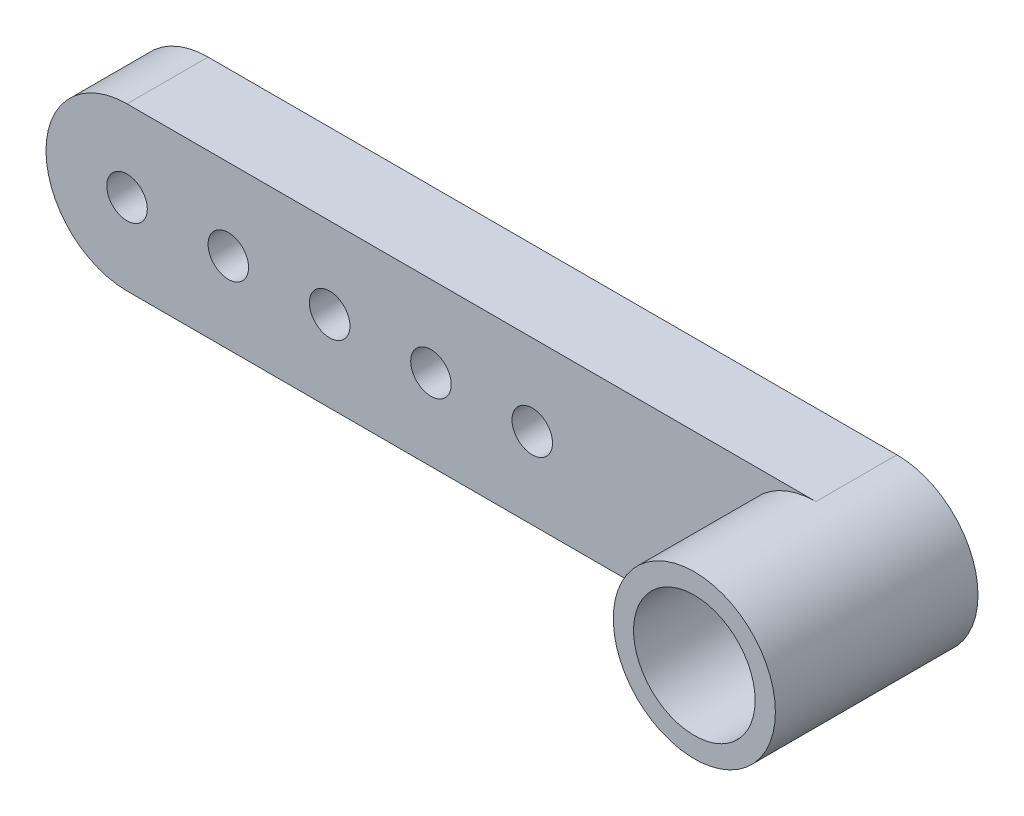
ISO-10303-21;
HEADER;
FILE_DESCRIPTION(('STEP AP214'),'2;1');
FILE_NAME('part.step','',(''),(''),'','','');
FILE_SCHEMA(('AUTOMOTIVE_DESIGN { 1 0 10303 214 1 1 1 1 }'));
ENDSEC;
DATA;
#1=APPLICATION_CONTEXT('core data for automotive mechanical design processes');
#2=APPLICATION_PROTOCOL_DEFINITION('international standard','automotive_design',2000,#1);
#3=PRODUCT_CONTEXT('',#1,'mechanical');
#4=PRODUCT('Part','Part','',(#3));
#5=PRODUCT_RELATED_PRODUCT_CATEGORY('part','',(#4));
#6=PRODUCT_DEFINITION_FORMATION('','',#4);
#7=PRODUCT_DEFINITION_CONTEXT('part definition',#1,'design');
#8=PRODUCT_DEFINITION('design','',#6,#7);
#9=PRODUCT_DEFINITION_SHAPE('','',#8);
#10=(LENGTH_UNIT() NAMED_UNIT(*) SI_UNIT(.MILLI.,.METRE.));
#11=(NAMED_UNIT(*) PLANE_ANGLE_UNIT() SI_UNIT($,.RADIAN.));
#12=(NAMED_UNIT(*) SI_UNIT($,.STERADIAN.) SOLID_ANGLE_UNIT());
#13=UNCERTAINTY_MEASURE_WITH_UNIT(LENGTH_MEASURE(1.E-05),#10,'distance_accuracy_value','');
#14=(GEOMETRIC_REPRESENTATION_CONTEXT(3) GLOBAL_UNCERTAINTY_ASSIGNED_CONTEXT((#13)) GLOBAL_UNIT_ASSIGNED_CONTEXT((#10,
#11,#12)) REPRESENTATION_CONTEXT('',''));
#15=CARTESIAN_POINT('',(0.,0.,0.));
#16=DIRECTION('',(0.,0.,1.));
#17=DIRECTION('',(1.,0.,0.));
#18=AXIS2_PLACEMENT_3D('',#15,#16,#17);
#19=CARTESIAN_POINT('',(-8.5,0.,2.));
#20=DIRECTION('',(0.,0.,-1.));
#21=DIRECTION('',(-1.,0.,0.));
#22=AXIS2_PLACEMENT_3D('',#19,#20,#21);
#23=CYLINDRICAL_SURFACE('',#22,2.);
#24=CARTESIAN_POINT('',(-8.5,0.,0.));
#25=DIRECTION('',(0.,0.,1.));
#26=DIRECTION('',(1.,0.,0.));
#27=AXIS2_PLACEMENT_3D('',#24,#25,#26);
#28=CIRCLE('',#27,2.);
#29=CARTESIAN_POINT('',(-8.5,2.,0.));
#30=VERTEX_POINT('',#29);
#31=CARTESIAN_POINT('',(-8.5,-2.,0.));
#32=VERTEX_POINT('',#31);
#33=EDGE_CURVE('E112',#30,#32,#28,.T.);
#34=ORIENTED_EDGE('',*,*,#33,.T.);
#35=DIRECTION('',(0.,0.,-1.));
#36=VECTOR('',#35,1.);
#37=CARTESIAN_POINT('',(-8.5,-2.,2.));
#38=LINE('',#37,#36);
#39=CARTESIAN_POINT('',(-8.5,-2.,2.));
#40=VERTEX_POINT('',#39);
#41=EDGE_CURVE('E11',#40,#32,#38,.T.);
#42=ORIENTED_EDGE('',*,*,#41,.F.);
#43=CARTESIAN_POINT('',(-8.5,0.,2.));
#44=DIRECTION('',(0.,0.,1.));
#45=DIRECTION('',(1.,0.,0.));
#46=AXIS2_PLACEMENT_3D('',#43,#44,#45);
#47=CIRCLE('',#46,2.);
#48=CARTESIAN_POINT('',(-8.5,2.,2.));
#49=VERTEX_POINT('',#48);
#50=EDGE_CURVE('E119',#49,#40,#47,.T.);
#51=ORIENTED_EDGE('',*,*,#50,.F.);
#52=DIRECTION('',(0.,0.,-1.));
#53=VECTOR('',#52,1.);
#54=CARTESIAN_POINT('',(-8.5,2.,2.));
#55=LINE('',#54,#53);
#56=EDGE_CURVE('E94',#49,#30,#55,.T.);
#57=ORIENTED_EDGE('',*,*,#56,.T.);
#58=EDGE_LOOP('',(#34,#42,#51,#57));
#59=FACE_BOUND('',#58,.T.);
#60=ADVANCED_FACE('F43',(#59),#23,.T.);
#61=CARTESIAN_POINT('',(-8.5,-2.,2.));
#62=DIRECTION('',(0.,1.,0.));
#63=DIRECTION('',(0.,0.,1.));
#64=AXIS2_PLACEMENT_3D('',#61,#62,#63);
#65=PLANE('',#64);
#66=DIRECTION('',(1.,0.,0.));
#67=VECTOR('',#66,1.);
#68=CARTESIAN_POINT('',(-8.5,-2.,0.));
#69=LINE('',#68,#67);
#70=CARTESIAN_POINT('',(8.5,-2.,0.));
#71=VERTEX_POINT('',#70);
#72=EDGE_CURVE('E127',#32,#71,#69,.T.);
#73=ORIENTED_EDGE('',*,*,#72,.T.);
#74=DIRECTION('',(0.,0.,-1.));
#75=VECTOR('',#74,1.);
#76=CARTESIAN_POINT('',(8.5,-2.,2.));
#77=LINE('',#76,#75);
#78=CARTESIAN_POINT('',(8.5,-2.,2.));
#79=VERTEX_POINT('',#78);
#80=EDGE_CURVE('E53',#79,#71,#77,.T.);
#81=ORIENTED_EDGE('',*,*,#80,.F.);
#82=DIRECTION('',(1.,0.,0.));
#83=VECTOR('',#82,1.);
#84=CARTESIAN_POINT('',(-8.5,-2.,2.));
#85=LINE('',#84,#83);
#86=EDGE_CURVE('E90',#40,#79,#85,.T.);
#87=ORIENTED_EDGE('',*,*,#86,.F.);
#88=ORIENTED_EDGE('',*,*,#41,.T.);
#89=EDGE_LOOP('',(#73,#81,#87,#88));
#90=FACE_BOUND('',#89,.T.);
#91=ADVANCED_FACE('F142',(#90),#65,.F.);
#92=CARTESIAN_POINT('',(8.5,0.,2.));
#93=DIRECTION('',(0.,0.,-1.));
#94=DIRECTION('',(-1.,0.,0.));
#95=AXIS2_PLACEMENT_3D('',#92,#93,#94);
#96=CYLINDRICAL_SURFACE('',#95,2.);
#97=CARTESIAN_POINT('',(8.5,0.,0.));
#98=DIRECTION('',(0.,0.,1.));
#99=DIRECTION('',(1.,0.,0.));
#100=AXIS2_PLACEMENT_3D('',#97,#98,#99);
#101=CIRCLE('',#100,2.);
#102=CARTESIAN_POINT('',(8.5,2.,0.));
#103=VERTEX_POINT('',#102);
#104=EDGE_CURVE('E80',#71,#103,#101,.T.);
#105=ORIENTED_EDGE('',*,*,#104,.T.);
#106=DIRECTION('',(0.,0.,-1.));
#107=VECTOR('',#106,1.);
#108=CARTESIAN_POINT('',(8.5,2.,2.));
#109=LINE('',#108,#107);
#110=CARTESIAN_POINT('',(8.5,2.,2.));
#111=VERTEX_POINT('',#110);
#112=EDGE_CURVE('E93',#111,#103,#109,.T.);
#113=ORIENTED_EDGE('',*,*,#112,.F.);
#114=CARTESIAN_POINT('',(8.5,0.,2.));
#115=DIRECTION('',(0.,0.,1.));
#116=DIRECTION('',(1.,0.,0.));
#117=AXIS2_PLACEMENT_3D('',#114,#115,#116);
#118=CIRCLE('',#117,2.);
#119=EDGE_CURVE('E101',#111,#79,#118,.T.);
#120=ORIENTED_EDGE('',*,*,#119,.T.);
#121=ORIENTED_EDGE('',*,*,#80,.T.);
#122=EDGE_LOOP('',(#105,#113,#120,#121));
#123=FACE_BOUND('',#122,.T.);
#124=CARTESIAN_POINT('',(8.5,0.,5.));
#125=DIRECTION('',(0.,0.,1.));
#126=DIRECTION('',(1.,0.,0.));
#127=AXIS2_PLACEMENT_3D('',#124,#125,#126);
#128=CIRCLE('',#127,2.);
#129=CARTESIAN_POINT('',(10.5,0.,5.));
#130=VERTEX_POINT('',#129);
#131=EDGE_CURVE('E106',#130,#130,#128,.T.);
#132=ORIENTED_EDGE('',*,*,#131,.F.);
#133=EDGE_LOOP('',(#132));
#134=FACE_BOUND('',#133,.T.);
#135=ADVANCED_FACE('F99',(#123,#134),#96,.T.);
#136=CARTESIAN_POINT('',(-8.5,2.,2.));
#137=DIRECTION('',(0.,-1.,0.));
#138=DIRECTION('',(0.,0.,-1.));
#139=AXIS2_PLACEMENT_3D('',#136,#137,#138);
#140=PLANE('',#139);
#141=DIRECTION('',(-1.,0.,0.));
#142=VECTOR('',#141,1.);
#143=CARTESIAN_POINT('',(-8.5,2.,0.));
#144=LINE('',#143,#142);
#145=EDGE_CURVE('E85',#103,#30,#144,.T.);
#146=ORIENTED_EDGE('',*,*,#145,.T.);
#147=ORIENTED_EDGE('',*,*,#56,.F.);
#148=DIRECTION('',(-1.,0.,0.));
#149=VECTOR('',#148,1.);
#150=CARTESIAN_POINT('',(-8.5,2.,2.));
#151=LINE('',#150,#149);
#152=EDGE_CURVE('E61',#111,#49,#151,.T.);
#153=ORIENTED_EDGE('',*,*,#152,.F.);
#154=ORIENTED_EDGE('',*,*,#112,.T.);
#155=EDGE_LOOP('',(#146,#147,#153,#154));
#156=FACE_BOUND('',#155,.T.);
#157=ADVANCED_FACE('F92',(#156),#140,.F.);
#158=CARTESIAN_POINT('',(-8.5,0.,2.));
#159=DIRECTION('',(0.,0.,1.));
#160=DIRECTION('',(1.,0.,0.));
#161=AXIS2_PLACEMENT_3D('',#158,#159,#160);
#162=PLANE('',#161);
#163=CARTESIAN_POINT('',(1.5,0.,2.));
#164=DIRECTION('',(0.,0.,1.));
#165=DIRECTION('',(1.,0.,0.));
#166=AXIS2_PLACEMENT_3D('',#163,#164,#165);
#167=CIRCLE('',#166,0.500000000000001);
#168=CARTESIAN_POINT('',(2.,0.,2.));
#169=VERTEX_POINT('',#168);
#170=EDGE_CURVE('E198',#169,#169,#167,.T.);
#171=ORIENTED_EDGE('',*,*,#170,.F.);
#172=EDGE_LOOP('',(#171));
#173=FACE_BOUND('',#172,.T.);
#174=CARTESIAN_POINT('',(-1.,0.,2.));
#175=DIRECTION('',(0.,0.,1.));
#176=DIRECTION('',(1.,0.,0.));
#177=AXIS2_PLACEMENT_3D('',#174,#175,#176);
#178=CIRCLE('',#177,0.500000000000001);
#179=CARTESIAN_POINT('',(-0.5,0.,2.));
#180=VERTEX_POINT('',#179);
#181=EDGE_CURVE('E233',#180,#180,#178,.T.);
#182=ORIENTED_EDGE('',*,*,#181,.F.);
#183=EDGE_LOOP('',(#182));
#184=FACE_BOUND('',#183,.T.);
#185=CARTESIAN_POINT('',(-3.5,0.,2.));
#186=DIRECTION('',(0.,0.,1.));
#187=DIRECTION('',(1.,0.,0.));
#188=AXIS2_PLACEMENT_3D('',#185,#186,#187);
#189=CIRCLE('',#188,0.500000000000001);
#190=CARTESIAN_POINT('',(-3.,0.,2.));
#191=VERTEX_POINT('',#190);
#192=EDGE_CURVE('E229',#191,#191,#189,.T.);
#193=ORIENTED_EDGE('',*,*,#192,.F.);
#194=EDGE_LOOP('',(#193));
#195=FACE_BOUND('',#194,.T.);
#196=CARTESIAN_POINT('',(-6.,0.,2.));
#197=DIRECTION('',(0.,0.,1.));
#198=DIRECTION('',(1.,0.,0.));
#199=AXIS2_PLACEMENT_3D('',#196,#197,#198);
#200=CIRCLE('',#199,0.500000000000001);
#201=CARTESIAN_POINT('',(-5.5,0.,2.));
#202=VERTEX_POINT('',#201);
#203=EDGE_CURVE('E209',#202,#202,#200,.T.);
#204=ORIENTED_EDGE('',*,*,#203,.F.);
#205=EDGE_LOOP('',(#204));
#206=FACE_BOUND('',#205,.T.);
#207=CARTESIAN_POINT('',(-8.50000000000001,0.,2.));
#208=DIRECTION('',(0.,0.,1.));
#209=DIRECTION('',(1.,0.,0.));
#210=AXIS2_PLACEMENT_3D('',#207,#208,#209);
#211=CIRCLE('',#210,0.500000000000003);
#212=CARTESIAN_POINT('',(-8.00000000000001,0.,2.));
#213=VERTEX_POINT('',#212);
#214=EDGE_CURVE('E203',#213,#213,#211,.T.);
#215=ORIENTED_EDGE('',*,*,#214,.F.);
#216=EDGE_LOOP('',(#215));
#217=FACE_BOUND('',#216,.T.);
#218=ORIENTED_EDGE('',*,*,#119,.F.);
#219=ORIENTED_EDGE('',*,*,#152,.T.);
#220=ORIENTED_EDGE('',*,*,#50,.T.);
#221=ORIENTED_EDGE('',*,*,#86,.T.);
#222=EDGE_LOOP('',(#218,#219,#220,#221));
#223=FACE_BOUND('',#222,.T.);
#224=ADVANCED_FACE('F104',(#173,#184,#195,#206,#217,#223),#162,.T.);
#225=CARTESIAN_POINT('',(-8.5,0.,0.));
#226=DIRECTION('',(0.,0.,1.));
#227=DIRECTION('',(1.,0.,0.));
#228=AXIS2_PLACEMENT_3D('',#225,#226,#227);
#229=PLANE('',#228);
#230=CARTESIAN_POINT('',(1.5,0.,0.));
#231=DIRECTION('',(0.,0.,-1.));
#232=DIRECTION('',(-1.,0.,0.));
#233=AXIS2_PLACEMENT_3D('',#230,#231,#232);
#234=CIRCLE('',#233,0.500000000000001);
#235=CARTESIAN_POINT('',(0.999999999999999,0.,0.));
#236=VERTEX_POINT('',#235);
#237=EDGE_CURVE('E201',#236,#236,#234,.T.);
#238=ORIENTED_EDGE('',*,*,#237,.F.);
#239=EDGE_LOOP('',(#238));
#240=FACE_BOUND('',#239,.T.);
#241=CARTESIAN_POINT('',(-1.,0.,0.));
#242=DIRECTION('',(0.,0.,-1.));
#243=DIRECTION('',(-1.,0.,0.));
#244=AXIS2_PLACEMENT_3D('',#241,#242,#243);
#245=CIRCLE('',#244,0.500000000000001);
#246=CARTESIAN_POINT('',(-1.5,0.,0.));
#247=VERTEX_POINT('',#246);
#248=EDGE_CURVE('E204',#247,#247,#245,.T.);
#249=ORIENTED_EDGE('',*,*,#248,.F.);
#250=EDGE_LOOP('',(#249));
#251=FACE_BOUND('',#250,.T.);
#252=CARTESIAN_POINT('',(-3.5,0.,0.));
#253=DIRECTION('',(0.,0.,-1.));
#254=DIRECTION('',(-1.,0.,0.));
#255=AXIS2_PLACEMENT_3D('',#252,#253,#254);
#256=CIRCLE('',#255,0.500000000000001);
#257=CARTESIAN_POINT('',(-4.,0.,0.));
#258=VERTEX_POINT('',#257);
#259=EDGE_CURVE('E212',#258,#258,#256,.T.);
#260=ORIENTED_EDGE('',*,*,#259,.F.);
#261=EDGE_LOOP('',(#260));
#262=FACE_BOUND('',#261,.T.);
#263=CARTESIAN_POINT('',(-6.,0.,0.));
#264=DIRECTION('',(0.,0.,-1.));
#265=DIRECTION('',(-1.,0.,0.));
#266=AXIS2_PLACEMENT_3D('',#263,#264,#265);
#267=CIRCLE('',#266,0.500000000000001);
#268=CARTESIAN_POINT('',(-6.5,0.,0.));
#269=VERTEX_POINT('',#268);
#270=EDGE_CURVE('E218',#269,#269,#267,.T.);
#271=ORIENTED_EDGE('',*,*,#270,.F.);
#272=EDGE_LOOP('',(#271));
#273=FACE_BOUND('',#272,.T.);
#274=CARTESIAN_POINT('',(-8.50000000000001,0.,0.));
#275=DIRECTION('',(0.,0.,-1.));
#276=DIRECTION('',(-1.,0.,0.));
#277=AXIS2_PLACEMENT_3D('',#274,#275,#276);
#278=CIRCLE('',#277,0.500000000000003);
#279=CARTESIAN_POINT('',(-9.00000000000001,0.,0.));
#280=VERTEX_POINT('',#279);
#281=EDGE_CURVE('E222',#280,#280,#278,.T.);
#282=ORIENTED_EDGE('',*,*,#281,.F.);
#283=EDGE_LOOP('',(#282));
#284=FACE_BOUND('',#283,.T.);
#285=CARTESIAN_POINT('',(8.5,0.,0.));
#286=DIRECTION('',(0.,0.,1.));
#287=DIRECTION('',(1.,0.,0.));
#288=AXIS2_PLACEMENT_3D('',#285,#286,#287);
#289=CIRCLE('',#288,1.);
#290=CARTESIAN_POINT('',(9.5,0.,0.));
#291=VERTEX_POINT('',#290);
#292=EDGE_CURVE('E46',#291,#291,#289,.T.);
#293=ORIENTED_EDGE('',*,*,#292,.T.);
#294=EDGE_LOOP('',(#293));
#295=FACE_BOUND('',#294,.T.);
#296=ORIENTED_EDGE('',*,*,#33,.F.);
#297=ORIENTED_EDGE('',*,*,#145,.F.);
#298=ORIENTED_EDGE('',*,*,#104,.F.);
#299=ORIENTED_EDGE('',*,*,#72,.F.);
#300=EDGE_LOOP('',(#296,#297,#298,#299));
#301=FACE_BOUND('',#300,.T.);
#302=ADVANCED_FACE('F139',(#240,#251,#262,#273,#284,#295,#301),#229,.F.);
#303=CARTESIAN_POINT('',(8.5,0.,5.));
#304=DIRECTION('',(0.,0.,1.));
#305=DIRECTION('',(1.,0.,0.));
#306=AXIS2_PLACEMENT_3D('',#303,#304,#305);
#307=PLANE('',#306);
#308=CARTESIAN_POINT('',(8.5,0.,5.));
#309=DIRECTION('',(0.,0.,1.));
#310=DIRECTION('',(1.,0.,0.));
#311=AXIS2_PLACEMENT_3D('',#308,#309,#310);
#312=CIRCLE('',#311,1.5);
#313=CARTESIAN_POINT('',(10.,0.,5.));
#314=VERTEX_POINT('',#313);
#315=EDGE_CURVE('E115',#314,#314,#312,.T.);
#316=ORIENTED_EDGE('',*,*,#315,.F.);
#317=EDGE_LOOP('',(#316));
#318=FACE_BOUND('',#317,.T.);
#319=ORIENTED_EDGE('',*,*,#131,.T.);
#320=EDGE_LOOP('',(#319));
#321=FACE_BOUND('',#320,.T.);
#322=ADVANCED_FACE('F154',(#318,#321),#307,.T.);
#323=CARTESIAN_POINT('',(8.5,0.,1.));
#324=DIRECTION('',(0.,0.,1.));
#325=DIRECTION('',(1.,0.,0.));
#326=AXIS2_PLACEMENT_3D('',#323,#324,#325);
#327=CYLINDRICAL_SURFACE('',#326,1.5);
#328=CARTESIAN_POINT('',(8.5,0.,1.));
#329=DIRECTION('',(0.,0.,1.));
#330=DIRECTION('',(1.,0.,0.));
#331=AXIS2_PLACEMENT_3D('',#328,#329,#330);
#332=CIRCLE('',#331,1.5);
#333=CARTESIAN_POINT('',(10.,0.,1.));
#334=VERTEX_POINT('',#333);
#335=EDGE_CURVE('E107',#334,#334,#332,.T.);
#336=ORIENTED_EDGE('',*,*,#335,.F.);
#337=EDGE_LOOP('',(#336));
#338=FACE_BOUND('',#337,.T.);
#339=ORIENTED_EDGE('',*,*,#315,.T.);
#340=EDGE_LOOP('',(#339));
#341=FACE_BOUND('',#340,.T.);
#342=ADVANCED_FACE('F161',(#338,#341),#327,.F.);
#343=CARTESIAN_POINT('',(8.5,0.,1.));
#344=DIRECTION('',(0.,0.,1.));
#345=DIRECTION('',(1.,0.,0.));
#346=AXIS2_PLACEMENT_3D('',#343,#344,#345);
#347=PLANE('',#346);
#348=CARTESIAN_POINT('',(8.5,0.,1.));
#349=DIRECTION('',(0.,0.,1.));
#350=DIRECTION('',(1.,0.,0.));
#351=AXIS2_PLACEMENT_3D('',#348,#349,#350);
#352=CIRCLE('',#351,1.);
#353=CARTESIAN_POINT('',(9.5,0.,1.));
#354=VERTEX_POINT('',#353);
#355=EDGE_CURVE('E239',#354,#354,#352,.T.);
#356=ORIENTED_EDGE('',*,*,#355,.F.);
#357=EDGE_LOOP('',(#356));
#358=FACE_BOUND('',#357,.T.);
#359=ORIENTED_EDGE('',*,*,#335,.T.);
#360=EDGE_LOOP('',(#359));
#361=FACE_BOUND('',#360,.T.);
#362=ADVANCED_FACE('F165',(#358,#361),#347,.T.);
#363=CARTESIAN_POINT('',(8.5,0.,-3.));
#364=DIRECTION('',(0.,0.,1.));
#365=DIRECTION('',(1.,0.,0.));
#366=AXIS2_PLACEMENT_3D('',#363,#364,#365);
#367=CYLINDRICAL_SURFACE('',#366,1.);
#368=ORIENTED_EDGE('',*,*,#355,.T.);
#369=EDGE_LOOP('',(#368));
#370=FACE_BOUND('',#369,.T.);
#371=ORIENTED_EDGE('',*,*,#292,.F.);
#372=EDGE_LOOP('',(#371));
#373=FACE_BOUND('',#372,.T.);
#374=ADVANCED_FACE('F169',(#370,#373),#367,.F.);
#375=CARTESIAN_POINT('',(-8.50000000000001,0.,10.));
#376=DIRECTION('',(0.,0.,-1.));
#377=DIRECTION('',(-1.,0.,0.));
#378=AXIS2_PLACEMENT_3D('',#375,#376,#377);
#379=CYLINDRICAL_SURFACE('',#378,0.500000000000003);
#380=ORIENTED_EDGE('',*,*,#214,.T.);
#381=EDGE_LOOP('',(#380));
#382=FACE_BOUND('',#381,.T.);
#383=ORIENTED_EDGE('',*,*,#281,.T.);
#384=EDGE_LOOP('',(#383));
#385=FACE_BOUND('',#384,.T.);
#386=ADVANCED_FACE('F173',(#382,#385),#379,.F.);
#387=CARTESIAN_POINT('',(-6.,0.,10.));
#388=DIRECTION('',(0.,0.,-1.));
#389=DIRECTION('',(-1.,0.,0.));
#390=AXIS2_PLACEMENT_3D('',#387,#388,#389);
#391=CYLINDRICAL_SURFACE('',#390,0.500000000000001);
#392=ORIENTED_EDGE('',*,*,#203,.T.);
#393=EDGE_LOOP('',(#392));
#394=FACE_BOUND('',#393,.T.);
#395=ORIENTED_EDGE('',*,*,#270,.T.);
#396=EDGE_LOOP('',(#395));
#397=FACE_BOUND('',#396,.T.);
#398=ADVANCED_FACE('F177',(#394,#397),#391,.F.);
#399=CARTESIAN_POINT('',(-3.5,0.,10.));
#400=DIRECTION('',(0.,0.,-1.));
#401=DIRECTION('',(-1.,0.,0.));
#402=AXIS2_PLACEMENT_3D('',#399,#400,#401);
#403=CYLINDRICAL_SURFACE('',#402,0.500000000000001);
#404=ORIENTED_EDGE('',*,*,#192,.T.);
#405=EDGE_LOOP('',(#404));
#406=FACE_BOUND('',#405,.T.);
#407=ORIENTED_EDGE('',*,*,#259,.T.);
#408=EDGE_LOOP('',(#407));
#409=FACE_BOUND('',#408,.T.);
#410=ADVANCED_FACE('F181',(#406,#409),#403,.F.);
#411=CARTESIAN_POINT('',(-1.,0.,10.));
#412=DIRECTION('',(0.,0.,-1.));
#413=DIRECTION('',(-1.,0.,0.));
#414=AXIS2_PLACEMENT_3D('',#411,#412,#413);
#415=CYLINDRICAL_SURFACE('',#414,0.500000000000001);
#416=ORIENTED_EDGE('',*,*,#181,.T.);
#417=EDGE_LOOP('',(#416));
#418=FACE_BOUND('',#417,.T.);
#419=ORIENTED_EDGE('',*,*,#248,.T.);
#420=EDGE_LOOP('',(#419));
#421=FACE_BOUND('',#420,.T.);
#422=ADVANCED_FACE('F185',(#418,#421),#415,.F.);
#423=CARTESIAN_POINT('',(1.5,0.,10.));
#424=DIRECTION('',(0.,0.,-1.));
#425=DIRECTION('',(-1.,0.,0.));
#426=AXIS2_PLACEMENT_3D('',#423,#424,#425);
#427=CYLINDRICAL_SURFACE('',#426,0.500000000000001);
#428=ORIENTED_EDGE('',*,*,#170,.T.);
#429=EDGE_LOOP('',(#428));
#430=FACE_BOUND('',#429,.T.);
#431=ORIENTED_EDGE('',*,*,#237,.T.);
#432=EDGE_LOOP('',(#431));
#433=FACE_BOUND('',#432,.T.);
#434=ADVANCED_FACE('F189',(#430,#433),#427,.F.);
#435=CLOSED_SHELL('',(#60,#91,#135,#157,#224,#302,#322,#342,#362,#374,#386,#398,#410,#422,#434));
#436=MANIFOLD_SOLID_BREP('B2',#435);
#437=ADVANCED_BREP_SHAPE_REPRESENTATION('',(#18,#436),#14);
#438=SHAPE_DEFINITION_REPRESENTATION(#9,#437);
ENDSEC;
END-ISO-10303-21;
